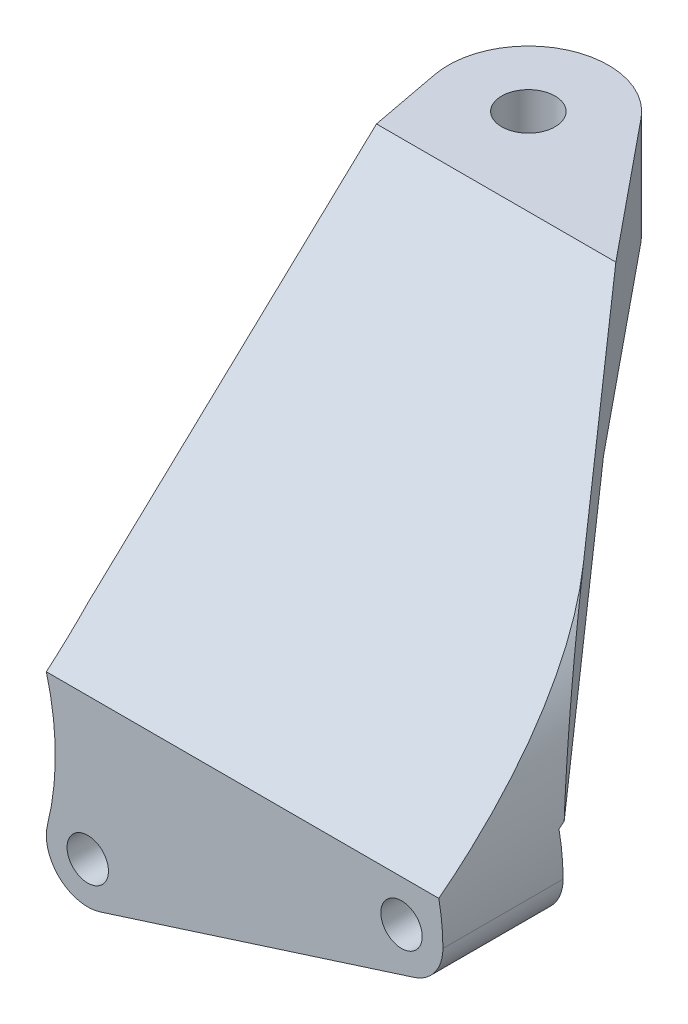
ISO-10303-21;
HEADER;
FILE_DESCRIPTION(('STEP AP214'),'2;1');
FILE_NAME('part.step','',(''),(''),'','','');
FILE_SCHEMA(('AUTOMOTIVE_DESIGN { 1 0 10303 214 1 1 1 1 }'));
ENDSEC;
DATA;
#1=APPLICATION_CONTEXT('core data for automotive mechanical design processes');
#2=APPLICATION_PROTOCOL_DEFINITION('international standard','automotive_design',2000,#1);
#3=PRODUCT_CONTEXT('',#1,'mechanical');
#4=PRODUCT('Part','Part','',(#3));
#5=PRODUCT_RELATED_PRODUCT_CATEGORY('part','',(#4));
#6=PRODUCT_DEFINITION_FORMATION('','',#4);
#7=PRODUCT_DEFINITION_CONTEXT('part definition',#1,'design');
#8=PRODUCT_DEFINITION('design','',#6,#7);
#9=PRODUCT_DEFINITION_SHAPE('','',#8);
#10=(LENGTH_UNIT() NAMED_UNIT(*) SI_UNIT(.MILLI.,.METRE.));
#11=(NAMED_UNIT(*) PLANE_ANGLE_UNIT() SI_UNIT($,.RADIAN.));
#12=(NAMED_UNIT(*) SI_UNIT($,.STERADIAN.) SOLID_ANGLE_UNIT());
#13=UNCERTAINTY_MEASURE_WITH_UNIT(LENGTH_MEASURE(1.E-05),#10,'distance_accuracy_value','');
#14=(GEOMETRIC_REPRESENTATION_CONTEXT(3) GLOBAL_UNCERTAINTY_ASSIGNED_CONTEXT((#13)) GLOBAL_UNIT_ASSIGNED_CONTEXT((#10,
#11,#12)) REPRESENTATION_CONTEXT('',''));
#15=CARTESIAN_POINT('',(0.,0.,0.));
#16=DIRECTION('',(0.,0.,1.));
#17=DIRECTION('',(1.,0.,0.));
#18=AXIS2_PLACEMENT_3D('',#15,#16,#17);
#19=CARTESIAN_POINT('',(23.5,7.50725648955731,-9.));
#20=DIRECTION('',(0.,0.,1.));
#21=DIRECTION('',(1.,0.,0.));
#22=AXIS2_PLACEMENT_3D('',#19,#20,#21);
#23=PLANE('',#22);
#24=CARTESIAN_POINT('',(23.5,7.50725648955731,-9.));
#25=DIRECTION('',(0.,0.,1.));
#26=DIRECTION('',(1.,0.,0.));
#27=AXIS2_PLACEMENT_3D('',#24,#25,#26);
#28=CIRCLE('',#27,1.55);
#29=CARTESIAN_POINT('',(25.05,7.50725648955731,-9.));
#30=VERTEX_POINT('',#29);
#31=EDGE_CURVE('E250',#30,#30,#28,.T.);
#32=ORIENTED_EDGE('',*,*,#31,.T.);
#33=EDGE_LOOP('',(#32));
#34=FACE_BOUND('',#33,.T.);
#35=CARTESIAN_POINT('',(0.,0.,-9.));
#36=DIRECTION('',(0.,0.,1.));
#37=DIRECTION('',(1.,0.,0.));
#38=AXIS2_PLACEMENT_3D('',#35,#36,#37);
#39=CIRCLE('',#38,1.55);
#40=CARTESIAN_POINT('',(1.55,0.,-9.));
#41=VERTEX_POINT('',#40);
#42=EDGE_CURVE('E158',#41,#41,#39,.T.);
#43=ORIENTED_EDGE('',*,*,#42,.T.);
#44=EDGE_LOOP('',(#43));
#45=FACE_BOUND('',#44,.T.);
#46=DIRECTION('',(-1.,0.,0.));
#47=VECTOR('',#46,1.);
#48=CARTESIAN_POINT('',(-3.1,10.6072564895573,-9.));
#49=LINE('',#48,#47);
#50=CARTESIAN_POINT('',(26.2927748438708,10.6072564895573,-9.));
#51=VERTEX_POINT('',#50);
#52=CARTESIAN_POINT('',(-3.09999999999999,10.6072564895573,-9.));
#53=VERTEX_POINT('',#52);
#54=EDGE_CURVE('E262',#51,#53,#49,.T.);
#55=ORIENTED_EDGE('',*,*,#54,.F.);
#56=CARTESIAN_POINT('',(10.8063921151052,7.50725648955729,-9.));
#57=DIRECTION('',(0.,0.,1.));
#58=DIRECTION('',(1.,0.,0.));
#59=AXIS2_PLACEMENT_3D('',#56,#57,#58);
#60=CIRCLE('',#59,15.7936078848948);
#61=CARTESIAN_POINT('',(26.6,7.50725648955729,-9.));
#62=VERTEX_POINT('',#61);
#63=EDGE_CURVE('E280',#51,#62,#60,.F.);
#64=ORIENTED_EDGE('',*,*,#63,.T.);
#65=CARTESIAN_POINT('',(23.5,7.50725648955731,-9.));
#66=DIRECTION('',(0.,0.,1.));
#67=DIRECTION('',(1.,0.,0.));
#68=AXIS2_PLACEMENT_3D('',#65,#66,#67);
#69=CIRCLE('',#68,3.1);
#70=CARTESIAN_POINT('',(24.4433520517887,4.55427716243936,-9.));
#71=VERTEX_POINT('',#70);
#72=EDGE_CURVE('E146',#71,#62,#69,.T.);
#73=ORIENTED_EDGE('',*,*,#72,.F.);
#74=DIRECTION('',(0.952573976489663,0.304307113480232,0.));
#75=VECTOR('',#74,1.);
#76=CARTESIAN_POINT('',(24.4433520517887,4.55427716243936,-9.));
#77=LINE('',#76,#75);
#78=CARTESIAN_POINT('',(0.943352051788718,-2.95297932711796,-9.));
#79=VERTEX_POINT('',#78);
#80=EDGE_CURVE('E149',#79,#71,#77,.T.);
#81=ORIENTED_EDGE('',*,*,#80,.F.);
#82=CARTESIAN_POINT('',(0.,0.,-9.));
#83=DIRECTION('',(0.,0.,1.));
#84=DIRECTION('',(1.,0.,0.));
#85=AXIS2_PLACEMENT_3D('',#82,#83,#84);
#86=CIRCLE('',#85,3.1);
#87=CARTESIAN_POINT('',(-3.00882555223066,0.746303421031855,-9.));
#88=VERTEX_POINT('',#87);
#89=EDGE_CURVE('E264',#88,#79,#86,.T.);
#90=ORIENTED_EDGE('',*,*,#89,.F.);
#91=CARTESIAN_POINT('',(-22.1740113617438,5.5,-9.));
#92=DIRECTION('',(0.,0.,1.));
#93=DIRECTION('',(1.,0.,0.));
#94=AXIS2_PLACEMENT_3D('',#91,#92,#93);
#95=CIRCLE('',#94,19.7459357407558);
#96=EDGE_CURVE('E299',#88,#53,#95,.T.);
#97=ORIENTED_EDGE('',*,*,#96,.T.);
#98=EDGE_LOOP('',(#55,#64,#73,#81,#90,#97));
#99=FACE_BOUND('',#98,.T.);
#100=ADVANCED_FACE('F41',(#34,#45,#99),#23,.F.);
#101=CARTESIAN_POINT('',(23.5,7.50725648955731,0.));
#102=DIRECTION('',(0.,0.,1.));
#103=DIRECTION('',(1.,0.,0.));
#104=AXIS2_PLACEMENT_3D('',#101,#102,#103);
#105=PLANE('',#104);
#106=CARTESIAN_POINT('',(10.8063921151052,7.50725648955729,0.));
#107=DIRECTION('',(0.,0.,-1.));
#108=DIRECTION('',(1.,0.,0.));
#109=AXIS2_PLACEMENT_3D('',#106,#107,#108);
#110=CIRCLE('',#109,15.7936078848948);
#111=CARTESIAN_POINT('',(26.2927748438709,10.6072564895573,0.));
#112=VERTEX_POINT('',#111);
#113=CARTESIAN_POINT('',(26.6,7.50725648955729,0.));
#114=VERTEX_POINT('',#113);
#115=EDGE_CURVE('E129',#112,#114,#110,.T.);
#116=ORIENTED_EDGE('',*,*,#115,.F.);
#117=DIRECTION('',(1.,0.,0.));
#118=VECTOR('',#117,1.);
#119=CARTESIAN_POINT('',(-50.,10.6072564895573,0.));
#120=LINE('',#119,#118);
#121=CARTESIAN_POINT('',(-3.09999999999999,10.6072564895573,0.));
#122=VERTEX_POINT('',#121);
#123=EDGE_CURVE('E195',#122,#112,#120,.T.);
#124=ORIENTED_EDGE('',*,*,#123,.F.);
#125=CARTESIAN_POINT('',(-22.1740113617438,5.5,0.));
#126=DIRECTION('',(0.,0.,1.));
#127=DIRECTION('',(-1.,0.,0.));
#128=AXIS2_PLACEMENT_3D('',#125,#126,#127);
#129=CIRCLE('',#128,19.7459357407558);
#130=CARTESIAN_POINT('',(-3.00882555223066,0.746303421031855,0.));
#131=VERTEX_POINT('',#130);
#132=EDGE_CURVE('E200',#131,#122,#129,.T.);
#133=ORIENTED_EDGE('',*,*,#132,.F.);
#134=CARTESIAN_POINT('',(0.,0.,0.));
#135=DIRECTION('',(0.,0.,1.));
#136=DIRECTION('',(1.,0.,0.));
#137=AXIS2_PLACEMENT_3D('',#134,#135,#136);
#138=CIRCLE('',#137,3.1);
#139=CARTESIAN_POINT('',(0.943352051788718,-2.95297932711796,0.));
#140=VERTEX_POINT('',#139);
#141=EDGE_CURVE('E157',#131,#140,#138,.T.);
#142=ORIENTED_EDGE('',*,*,#141,.T.);
#143=DIRECTION('',(0.952573976489663,0.304307113480232,0.));
#144=VECTOR('',#143,1.);
#145=CARTESIAN_POINT('',(24.4433520517887,4.55427716243936,0.));
#146=LINE('',#145,#144);
#147=CARTESIAN_POINT('',(24.4433520517887,4.55427716243936,0.));
#148=VERTEX_POINT('',#147);
#149=EDGE_CURVE('E155',#140,#148,#146,.T.);
#150=ORIENTED_EDGE('',*,*,#149,.T.);
#151=CARTESIAN_POINT('',(23.5,7.50725648955731,0.));
#152=DIRECTION('',(0.,0.,1.));
#153=DIRECTION('',(1.,0.,0.));
#154=AXIS2_PLACEMENT_3D('',#151,#152,#153);
#155=CIRCLE('',#154,3.1);
#156=EDGE_CURVE('E143',#148,#114,#155,.T.);
#157=ORIENTED_EDGE('',*,*,#156,.T.);
#158=EDGE_LOOP('',(#116,#124,#133,#142,#150,#157));
#159=FACE_BOUND('',#158,.T.);
#160=CARTESIAN_POINT('',(0.,0.,0.));
#161=DIRECTION('',(0.,0.,1.));
#162=DIRECTION('',(1.,0.,0.));
#163=AXIS2_PLACEMENT_3D('',#160,#161,#162);
#164=CIRCLE('',#163,1.55);
#165=CARTESIAN_POINT('',(1.55,0.,0.));
#166=VERTEX_POINT('',#165);
#167=EDGE_CURVE('E165',#166,#166,#164,.T.);
#168=ORIENTED_EDGE('',*,*,#167,.F.);
#169=EDGE_LOOP('',(#168));
#170=FACE_BOUND('',#169,.T.);
#171=CARTESIAN_POINT('',(23.5,7.50725648955731,0.));
#172=DIRECTION('',(0.,0.,1.));
#173=DIRECTION('',(1.,0.,0.));
#174=AXIS2_PLACEMENT_3D('',#171,#172,#173);
#175=CIRCLE('',#174,1.55);
#176=CARTESIAN_POINT('',(25.05,7.50725648955731,0.));
#177=VERTEX_POINT('',#176);
#178=EDGE_CURVE('E246',#177,#177,#175,.T.);
#179=ORIENTED_EDGE('',*,*,#178,.F.);
#180=EDGE_LOOP('',(#179));
#181=FACE_BOUND('',#180,.T.);
#182=ADVANCED_FACE('F151',(#159,#170,#181),#105,.T.);
#183=CARTESIAN_POINT('',(23.5,7.50725648955731,-9.));
#184=DIRECTION('',(0.,0.,1.));
#185=DIRECTION('',(1.,0.,0.));
#186=AXIS2_PLACEMENT_3D('',#183,#184,#185);
#187=CYLINDRICAL_SURFACE('',#186,3.1);
#188=ORIENTED_EDGE('',*,*,#156,.F.);
#189=DIRECTION('',(0.,0.,1.));
#190=VECTOR('',#189,1.);
#191=CARTESIAN_POINT('',(24.4433520517887,4.55427716243936,-9.));
#192=LINE('',#191,#190);
#193=EDGE_CURVE('E172',#71,#148,#192,.T.);
#194=ORIENTED_EDGE('',*,*,#193,.F.);
#195=ORIENTED_EDGE('',*,*,#72,.T.);
#196=DIRECTION('',(0.,0.,1.));
#197=VECTOR('',#196,1.);
#198=CARTESIAN_POINT('',(26.6,7.50725648955729,-9.));
#199=LINE('',#198,#197);
#200=EDGE_CURVE('E132',#62,#114,#199,.T.);
#201=ORIENTED_EDGE('',*,*,#200,.T.);
#202=EDGE_LOOP('',(#188,#194,#195,#201));
#203=FACE_BOUND('',#202,.T.);
#204=ADVANCED_FACE('F43',(#203),#187,.T.);
#205=CARTESIAN_POINT('',(24.4433520517887,4.55427716243936,-9.));
#206=DIRECTION('',(0.304307113480232,-0.952573976489663,0.));
#207=DIRECTION('',(0.952573976489663,0.304307113480232,0.));
#208=AXIS2_PLACEMENT_3D('',#205,#206,#207);
#209=PLANE('',#208);
#210=ORIENTED_EDGE('',*,*,#149,.F.);
#211=DIRECTION('',(0.,0.,1.));
#212=VECTOR('',#211,1.);
#213=CARTESIAN_POINT('',(0.943352051788718,-2.95297932711796,-9.));
#214=LINE('',#213,#212);
#215=EDGE_CURVE('E148',#79,#140,#214,.T.);
#216=ORIENTED_EDGE('',*,*,#215,.F.);
#217=ORIENTED_EDGE('',*,*,#80,.T.);
#218=ORIENTED_EDGE('',*,*,#193,.T.);
#219=EDGE_LOOP('',(#210,#216,#217,#218));
#220=FACE_BOUND('',#219,.T.);
#221=ADVANCED_FACE('F275',(#220),#209,.T.);
#222=CARTESIAN_POINT('',(0.,0.,-9.));
#223=DIRECTION('',(0.,0.,1.));
#224=DIRECTION('',(1.,0.,0.));
#225=AXIS2_PLACEMENT_3D('',#222,#223,#224);
#226=CYLINDRICAL_SURFACE('',#225,3.1);
#227=ORIENTED_EDGE('',*,*,#141,.F.);
#228=DIRECTION('',(0.,0.,1.));
#229=VECTOR('',#228,1.);
#230=CARTESIAN_POINT('',(-3.00882555223066,0.746303421031855,-43.));
#231=LINE('',#230,#229);
#232=EDGE_CURVE('E288',#88,#131,#231,.T.);
#233=ORIENTED_EDGE('',*,*,#232,.F.);
#234=ORIENTED_EDGE('',*,*,#89,.T.);
#235=ORIENTED_EDGE('',*,*,#215,.T.);
#236=EDGE_LOOP('',(#227,#233,#234,#235));
#237=FACE_BOUND('',#236,.T.);
#238=ADVANCED_FACE('F360',(#237),#226,.T.);
#239=CARTESIAN_POINT('',(0.,0.,-9.));
#240=DIRECTION('',(0.,0.,1.));
#241=DIRECTION('',(1.,0.,0.));
#242=AXIS2_PLACEMENT_3D('',#239,#240,#241);
#243=CYLINDRICAL_SURFACE('',#242,1.55);
#244=ORIENTED_EDGE('',*,*,#42,.F.);
#245=EDGE_LOOP('',(#244));
#246=FACE_BOUND('',#245,.T.);
#247=ORIENTED_EDGE('',*,*,#167,.T.);
#248=EDGE_LOOP('',(#247));
#249=FACE_BOUND('',#248,.T.);
#250=ADVANCED_FACE('F356',(#246,#249),#243,.F.);
#251=CARTESIAN_POINT('',(23.5,7.50725648955731,-9.));
#252=DIRECTION('',(0.,0.,1.));
#253=DIRECTION('',(1.,0.,0.));
#254=AXIS2_PLACEMENT_3D('',#251,#252,#253);
#255=CYLINDRICAL_SURFACE('',#254,1.55);
#256=ORIENTED_EDGE('',*,*,#31,.F.);
#257=EDGE_LOOP('',(#256));
#258=FACE_BOUND('',#257,.T.);
#259=ORIENTED_EDGE('',*,*,#178,.T.);
#260=EDGE_LOOP('',(#259));
#261=FACE_BOUND('',#260,.T.);
#262=ADVANCED_FACE('F332',(#258,#261),#255,.F.);
#263=CARTESIAN_POINT('',(-4.,28.,-37.));
#264=DIRECTION('',(0.,1.,0.));
#265=DIRECTION('',(0.,0.,1.));
#266=AXIS2_PLACEMENT_3D('',#263,#264,#265);
#267=PLANE('',#266);
#268=DIRECTION('',(1.,0.,0.));
#269=VECTOR('',#268,1.);
#270=CARTESIAN_POINT('',(-50.,28.,-30.5));
#271=LINE('',#270,#269);
#272=CARTESIAN_POINT('',(-8.87573859024439,28.,-30.5));
#273=VERTEX_POINT('',#272);
#274=CARTESIAN_POINT('',(9.05064600927865,28.,-30.5));
#275=VERTEX_POINT('',#274);
#276=EDGE_CURVE('E183',#273,#275,#271,.T.);
#277=ORIENTED_EDGE('',*,*,#276,.T.);
#278=DIRECTION('',(-0.632340456491697,0.,-0.774690613783252));
#279=VECTOR('',#278,1.);
#280=CARTESIAN_POINT('',(26.6,28.,-9.));
#281=LINE('',#280,#279);
#282=CARTESIAN_POINT('',(0.648143682699515,28.,-40.7940427389502));
#283=VERTEX_POINT('',#282);
#284=EDGE_CURVE('E231',#275,#283,#281,.T.);
#285=ORIENTED_EDGE('',*,*,#284,.T.);
#286=CARTESIAN_POINT('',(-4.,28.,-37.));
#287=DIRECTION('',(0.,1.,0.));
#288=DIRECTION('',(0.,0.,1.));
#289=AXIS2_PLACEMENT_3D('',#286,#287,#288);
#290=CIRCLE('',#289,6.);
#291=CARTESIAN_POINT('',(-9.89522833211987,28.,-35.8836295811106));
#292=VERTEX_POINT('',#291);
#293=EDGE_CURVE('E234',#283,#292,#290,.T.);
#294=ORIENTED_EDGE('',*,*,#293,.T.);
#295=DIRECTION('',(-0.186061736481567,0.,-0.98253805535331));
#296=VECTOR('',#295,1.);
#297=CARTESIAN_POINT('',(-3.1,28.,0.));
#298=LINE('',#297,#296);
#299=EDGE_CURVE('E238',#273,#292,#298,.T.);
#300=ORIENTED_EDGE('',*,*,#299,.F.);
#301=EDGE_LOOP('',(#277,#285,#294,#300));
#302=FACE_BOUND('',#301,.T.);
#303=CARTESIAN_POINT('',(-4.,28.,-37.));
#304=DIRECTION('',(0.,1.,0.));
#305=DIRECTION('',(0.,0.,1.));
#306=AXIS2_PLACEMENT_3D('',#303,#304,#305);
#307=CIRCLE('',#306,2.);
#308=CARTESIAN_POINT('',(-4.,28.,-35.));
#309=VERTEX_POINT('',#308);
#310=EDGE_CURVE('E227',#309,#309,#307,.T.);
#311=ORIENTED_EDGE('',*,*,#310,.F.);
#312=EDGE_LOOP('',(#311));
#313=FACE_BOUND('',#312,.T.);
#314=ADVANCED_FACE('F324',(#302,#313),#267,.T.);
#315=CARTESIAN_POINT('',(26.6,-45.8600792010878,-9.));
#316=DIRECTION('',(0.774690613783252,0.,-0.632340456491697));
#317=DIRECTION('',(-0.632340456491697,0.,-0.774690613783252));
#318=AXIS2_PLACEMENT_3D('',#315,#316,#317);
#319=PLANE('',#318);
#320=CARTESIAN_POINT('',(10.8063921151052,7.50725648955729,-28.3490067899235));
#321=DIRECTION('',(0.774690613783252,0.,-0.632340456491697));
#322=DIRECTION('',(0.632340456491697,0.,0.774690613783252));
#323=AXIS2_PLACEMENT_3D('',#320,#321,#322);
#324=ELLIPSE('',#323,24.9764311657673,15.7936078848948);
#325=CARTESIAN_POINT('',(26.2403515875024,10.8585167041947,-9.44061114003321));
#326=VERTEX_POINT('',#325);
#327=CARTESIAN_POINT('',(19.8515003160245,20.4542278595524,-17.2676971062402));
#328=VERTEX_POINT('',#327);
#329=EDGE_CURVE('E57',#326,#328,#324,.F.);
#330=ORIENTED_EDGE('',*,*,#329,.F.);
#331=DIRECTION('',(0.578412616114516,-0.404094868832214,0.708622736371786));
#332=VECTOR('',#331,1.);
#333=CARTESIAN_POINT('',(39.7983119728977,1.38655487118386,7.16946740987341));
#334=LINE('',#333,#332);
#335=CARTESIAN_POINT('',(13.1554310004773,20.,-25.4711609123942));
#336=VERTEX_POINT('',#335);
#337=EDGE_CURVE('E223',#336,#326,#334,.T.);
#338=ORIENTED_EDGE('',*,*,#337,.F.);
#339=DIRECTION('',(0.632340456491697,0.,0.774690613783252));
#340=VECTOR('',#339,1.);
#341=CARTESIAN_POINT('',(26.6,20.,-9.));
#342=LINE('',#341,#340);
#343=CARTESIAN_POINT('',(0.648143682699515,20.,-40.7940427389502));
#344=VERTEX_POINT('',#343);
#345=EDGE_CURVE('E217',#344,#336,#342,.T.);
#346=ORIENTED_EDGE('',*,*,#345,.F.);
#347=DIRECTION('',(0.,1.,0.));
#348=VECTOR('',#347,1.);
#349=CARTESIAN_POINT('',(0.648143682699515,-45.8600792010878,-40.7940427389502));
#350=LINE('',#349,#348);
#351=EDGE_CURVE('E241',#344,#283,#350,.T.);
#352=ORIENTED_EDGE('',*,*,#351,.T.);
#353=ORIENTED_EDGE('',*,*,#284,.F.);
#354=DIRECTION('',(-0.578412616114516,0.404094868832214,-0.708622736371786));
#355=VECTOR('',#354,1.);
#356=CARTESIAN_POINT('',(40.9978992624922,5.68077536131933,8.63910137702213));
#357=LINE('',#356,#355);
#358=EDGE_CURVE('E220',#328,#275,#357,.T.);
#359=ORIENTED_EDGE('',*,*,#358,.F.);
#360=EDGE_LOOP('',(#330,#338,#346,#352,#353,#359));
#361=FACE_BOUND('',#360,.T.);
#362=ADVANCED_FACE('F318',(#361),#319,.T.);
#363=CARTESIAN_POINT('',(-4.,-45.8600792010878,-37.));
#364=DIRECTION('',(0.,1.,0.));
#365=DIRECTION('',(0.,0.,1.));
#366=AXIS2_PLACEMENT_3D('',#363,#364,#365);
#367=CYLINDRICAL_SURFACE('',#366,6.);
#368=CARTESIAN_POINT('',(-4.,20.,-37.));
#369=DIRECTION('',(0.,1.,0.));
#370=DIRECTION('',(0.,0.,1.));
#371=AXIS2_PLACEMENT_3D('',#368,#369,#370);
#372=CIRCLE('',#371,6.);
#373=CARTESIAN_POINT('',(-9.89522833211987,20.,-35.8836295811106));
#374=VERTEX_POINT('',#373);
#375=EDGE_CURVE('E214',#374,#344,#372,.F.);
#376=ORIENTED_EDGE('',*,*,#375,.F.);
#377=DIRECTION('',(0.,1.,0.));
#378=VECTOR('',#377,1.);
#379=CARTESIAN_POINT('',(-9.89522833211987,-45.8600792010878,-35.8836295811106));
#380=LINE('',#379,#378);
#381=EDGE_CURVE('E242',#374,#292,#380,.T.);
#382=ORIENTED_EDGE('',*,*,#381,.T.);
#383=ORIENTED_EDGE('',*,*,#293,.F.);
#384=ORIENTED_EDGE('',*,*,#351,.F.);
#385=EDGE_LOOP('',(#376,#382,#383,#384));
#386=FACE_BOUND('',#385,.T.);
#387=ADVANCED_FACE('F321',(#386),#367,.T.);
#388=CARTESIAN_POINT('',(-3.1,-45.8600792010878,0.));
#389=DIRECTION('',(0.98253805535331,0.,-0.186061736481567));
#390=DIRECTION('',(-0.186061736481567,0.,-0.98253805535331));
#391=AXIS2_PLACEMENT_3D('',#388,#389,#390);
#392=PLANE('',#391);
#393=DIRECTION('',(0.16231948764011,-0.488800033304736,0.857162126656061));
#394=VECTOR('',#393,1.);
#395=CARTESIAN_POINT('',(0.973013836704717,-6.79027973292241,21.5084045232451));
#396=LINE('',#395,#394);
#397=CARTESIAN_POINT('',(-7.92343498426361,20.,-25.4711609123942));
#398=VERTEX_POINT('',#397);
#399=CARTESIAN_POINT('',(-7.49358291155266,18.7055669623411,-23.2012368130196));
#400=VERTEX_POINT('',#399);
#401=EDGE_CURVE('E186',#398,#400,#396,.T.);
#402=ORIENTED_EDGE('',*,*,#401,.T.);
#403=CARTESIAN_POINT('',(-22.1740113617438,5.5,-100.724320784845));
#404=DIRECTION('',(0.98253805535331,0.,-0.186061736481567));
#405=DIRECTION('',(0.186061736481567,0.,0.98253805535331));
#406=AXIS2_PLACEMENT_3D('',#403,#404,#405);
#407=ELLIPSE('',#406,106.125719958074,19.7459357407558);
#408=CARTESIAN_POINT('',(-3.83385471616214,12.8171464720603,-3.87527387073072));
#409=VERTEX_POINT('',#408);
#410=EDGE_CURVE('E296',#400,#409,#407,.T.);
#411=ORIENTED_EDGE('',*,*,#410,.T.);
#412=DIRECTION('',(-0.16231948764011,0.488800033304736,-0.857162126656061));
#413=VECTOR('',#412,1.);
#414=CARTESIAN_POINT('',(1.38021841534234,-2.88422837446145,23.6587337762735));
#415=LINE('',#414,#413);
#416=EDGE_CURVE('E175',#409,#273,#415,.T.);
#417=ORIENTED_EDGE('',*,*,#416,.T.);
#418=ORIENTED_EDGE('',*,*,#299,.T.);
#419=ORIENTED_EDGE('',*,*,#381,.F.);
#420=DIRECTION('',(0.186061736481567,0.,0.98253805535331));
#421=VECTOR('',#420,1.);
#422=CARTESIAN_POINT('',(-3.1,20.,0.));
#423=LINE('',#422,#421);
#424=EDGE_CURVE('E182',#374,#398,#423,.T.);
#425=ORIENTED_EDGE('',*,*,#424,.T.);
#426=EDGE_LOOP('',(#402,#411,#417,#418,#419,#425));
#427=FACE_BOUND('',#426,.T.);
#428=ADVANCED_FACE('F309',(#427),#392,.F.);
#429=CARTESIAN_POINT('',(-4.,-46.4247525579942,-37.));
#430=DIRECTION('',(0.,1.,0.));
#431=DIRECTION('',(0.,0.,1.));
#432=AXIS2_PLACEMENT_3D('',#429,#430,#431);
#433=CYLINDRICAL_SURFACE('',#432,2.);
#434=CARTESIAN_POINT('',(-4.,20.,-37.));
#435=DIRECTION('',(0.,1.,0.));
#436=DIRECTION('',(0.,0.,1.));
#437=AXIS2_PLACEMENT_3D('',#434,#435,#436);
#438=CIRCLE('',#437,2.);
#439=CARTESIAN_POINT('',(-4.,20.,-35.));
#440=VERTEX_POINT('',#439);
#441=EDGE_CURVE('E178',#440,#440,#438,.F.);
#442=ORIENTED_EDGE('',*,*,#441,.T.);
#443=EDGE_LOOP('',(#442));
#444=FACE_BOUND('',#443,.T.);
#445=ORIENTED_EDGE('',*,*,#310,.T.);
#446=EDGE_LOOP('',(#445));
#447=FACE_BOUND('',#446,.T.);
#448=ADVANCED_FACE('F336',(#444,#447),#433,.F.);
#449=CARTESIAN_POINT('',(-50.,10.6072564895573,-9.));
#450=DIRECTION('',(0.,0.868682370719737,0.495369497244973));
#451=DIRECTION('',(0.,-0.495369497244973,0.868682370719737));
#452=AXIS2_PLACEMENT_3D('',#449,#450,#451);
#453=PLANE('',#452);
#454=ORIENTED_EDGE('',*,*,#337,.T.);
#455=CARTESIAN_POINT('',(10.8063921151052,7.50725648955729,-3.56382485355272));
#456=DIRECTION('',(0.,0.868682370719737,0.495369497244973));
#457=DIRECTION('',(0.,-0.495369497244973,0.868682370719737));
#458=AXIS2_PLACEMENT_3D('',#455,#456,#457);
#459=ELLIPSE('',#458,31.8824795889369,15.7936078848948);
#460=EDGE_CURVE('E283',#326,#51,#459,.F.);
#461=ORIENTED_EDGE('',*,*,#460,.T.);
#462=ORIENTED_EDGE('',*,*,#54,.T.);
#463=CARTESIAN_POINT('',(-22.1740113617438,5.5,-0.0438900661087621));
#464=DIRECTION('',(0.,0.868682370719737,0.495369497244973));
#465=DIRECTION('',(0.,-0.495369497244973,0.868682370719737));
#466=AXIS2_PLACEMENT_3D('',#463,#464,#465);
#467=ELLIPSE('',#466,39.8610246504357,19.7459357407558);
#468=EDGE_CURVE('E208',#53,#400,#467,.T.);
#469=ORIENTED_EDGE('',*,*,#468,.T.);
#470=ORIENTED_EDGE('',*,*,#401,.F.);
#471=DIRECTION('',(1.,0.,0.));
#472=VECTOR('',#471,1.);
#473=CARTESIAN_POINT('',(-50.,20.,-25.4711609123942));
#474=LINE('',#473,#472);
#475=EDGE_CURVE('E64',#398,#336,#474,.T.);
#476=ORIENTED_EDGE('',*,*,#475,.T.);
#477=EDGE_LOOP('',(#454,#461,#462,#469,#470,#476));
#478=FACE_BOUND('',#477,.T.);
#479=ADVANCED_FACE('F307',(#478),#453,.F.);
#480=CARTESIAN_POINT('',(-50.,20.,-43.));
#481=DIRECTION('',(0.,1.,0.));
#482=DIRECTION('',(0.,0.,1.));
#483=AXIS2_PLACEMENT_3D('',#480,#481,#482);
#484=PLANE('',#483);
#485=ORIENTED_EDGE('',*,*,#345,.T.);
#486=ORIENTED_EDGE('',*,*,#475,.F.);
#487=ORIENTED_EDGE('',*,*,#424,.F.);
#488=ORIENTED_EDGE('',*,*,#375,.T.);
#489=EDGE_LOOP('',(#485,#486,#487,#488));
#490=FACE_BOUND('',#489,.T.);
#491=ORIENTED_EDGE('',*,*,#441,.F.);
#492=EDGE_LOOP('',(#491));
#493=FACE_BOUND('',#492,.T.);
#494=ADVANCED_FACE('F311',(#490,#493),#484,.F.);
#495=CARTESIAN_POINT('',(-50.,10.6072564895573,0.));
#496=DIRECTION('',(0.,-0.868682370719737,-0.495369497244973));
#497=DIRECTION('',(0.,0.495369497244973,-0.868682370719737));
#498=AXIS2_PLACEMENT_3D('',#495,#496,#497);
#499=PLANE('',#498);
#500=ORIENTED_EDGE('',*,*,#123,.T.);
#501=CARTESIAN_POINT('',(10.8063921151052,7.50725648955729,5.43617514644728));
#502=DIRECTION('',(0.,-0.868682370719737,-0.495369497244973));
#503=DIRECTION('',(0.,-0.495369497244973,0.868682370719737));
#504=AXIS2_PLACEMENT_3D('',#501,#502,#503);
#505=ELLIPSE('',#504,31.8824795889369,15.7936078848948);
#506=EDGE_CURVE('E12',#112,#328,#505,.F.);
#507=ORIENTED_EDGE('',*,*,#506,.T.);
#508=ORIENTED_EDGE('',*,*,#358,.T.);
#509=ORIENTED_EDGE('',*,*,#276,.F.);
#510=ORIENTED_EDGE('',*,*,#416,.F.);
#511=CARTESIAN_POINT('',(-22.1740113617438,5.5,8.95610993389123));
#512=DIRECTION('',(0.,-0.868682370719737,-0.495369497244973));
#513=DIRECTION('',(0.,-0.495369497244973,0.868682370719737));
#514=AXIS2_PLACEMENT_3D('',#511,#512,#513);
#515=ELLIPSE('',#514,39.8610246504357,19.7459357407558);
#516=EDGE_CURVE('E50',#409,#122,#515,.T.);
#517=ORIENTED_EDGE('',*,*,#516,.T.);
#518=EDGE_LOOP('',(#500,#507,#508,#509,#510,#517));
#519=FACE_BOUND('',#518,.T.);
#520=ADVANCED_FACE('F194',(#519),#499,.F.);
#521=CARTESIAN_POINT('',(-22.1740113617438,5.5,-43.));
#522=DIRECTION('',(0.,0.,1.));
#523=DIRECTION('',(1.,0.,0.));
#524=AXIS2_PLACEMENT_3D('',#521,#522,#523);
#525=CYLINDRICAL_SURFACE('',#524,19.7459357407558);
#526=ORIENTED_EDGE('',*,*,#468,.F.);
#527=ORIENTED_EDGE('',*,*,#96,.F.);
#528=ORIENTED_EDGE('',*,*,#232,.T.);
#529=ORIENTED_EDGE('',*,*,#132,.T.);
#530=ORIENTED_EDGE('',*,*,#516,.F.);
#531=ORIENTED_EDGE('',*,*,#410,.F.);
#532=EDGE_LOOP('',(#526,#527,#528,#529,#530,#531));
#533=FACE_BOUND('',#532,.T.);
#534=ADVANCED_FACE('F366',(#533),#525,.F.);
#535=CARTESIAN_POINT('',(10.8063921151052,7.50725648955729,-43.));
#536=DIRECTION('',(0.,0.,1.));
#537=DIRECTION('',(1.,0.,0.));
#538=AXIS2_PLACEMENT_3D('',#535,#536,#537);
#539=CYLINDRICAL_SURFACE('',#538,15.7936078848948);
#540=ORIENTED_EDGE('',*,*,#460,.F.);
#541=ORIENTED_EDGE('',*,*,#329,.T.);
#542=ORIENTED_EDGE('',*,*,#506,.F.);
#543=ORIENTED_EDGE('',*,*,#115,.T.);
#544=ORIENTED_EDGE('',*,*,#200,.F.);
#545=ORIENTED_EDGE('',*,*,#63,.F.);
#546=EDGE_LOOP('',(#540,#541,#542,#543,#544,#545));
#547=FACE_BOUND('',#546,.T.);
#548=ADVANCED_FACE('F131',(#547),#539,.T.);
#549=CLOSED_SHELL('',(#100,#182,#204,#221,#238,#250,#262,#314,#362,#387,#428,#448,#479,#494,
#520,#534,#548));
#550=MANIFOLD_SOLID_BREP('B2',#549);
#551=ADVANCED_BREP_SHAPE_REPRESENTATION('',(#18,#550),#14);
#552=SHAPE_DEFINITION_REPRESENTATION(#9,#551);
ENDSEC;
END-ISO-10303-21;
